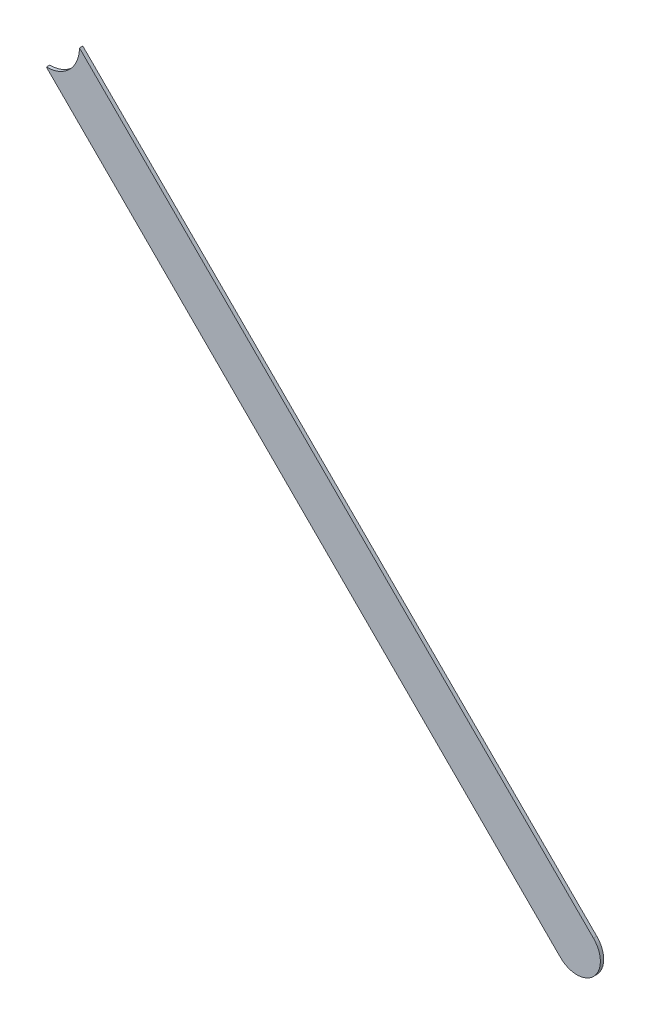
ISO-10303-21;
HEADER;
FILE_DESCRIPTION(('STEP AP214'),'2;1');
FILE_NAME('part.step','',(''),(''),'','','');
FILE_SCHEMA(('AUTOMOTIVE_DESIGN { 1 0 10303 214 1 1 1 1 }'));
ENDSEC;
DATA;
#1=APPLICATION_CONTEXT('core data for automotive mechanical design processes');
#2=APPLICATION_PROTOCOL_DEFINITION('international standard','automotive_design',2000,#1);
#3=PRODUCT_CONTEXT('',#1,'mechanical');
#4=PRODUCT('Part','Part','',(#3));
#5=PRODUCT_RELATED_PRODUCT_CATEGORY('part','',(#4));
#6=PRODUCT_DEFINITION_FORMATION('','',#4);
#7=PRODUCT_DEFINITION_CONTEXT('part definition',#1,'design');
#8=PRODUCT_DEFINITION('design','',#6,#7);
#9=PRODUCT_DEFINITION_SHAPE('','',#8);
#10=(LENGTH_UNIT() NAMED_UNIT(*) SI_UNIT(.MILLI.,.METRE.));
#11=(NAMED_UNIT(*) PLANE_ANGLE_UNIT() SI_UNIT($,.RADIAN.));
#12=(NAMED_UNIT(*) SI_UNIT($,.STERADIAN.) SOLID_ANGLE_UNIT());
#13=UNCERTAINTY_MEASURE_WITH_UNIT(LENGTH_MEASURE(1.E-05),#10,'distance_accuracy_value','');
#14=(GEOMETRIC_REPRESENTATION_CONTEXT(3) GLOBAL_UNCERTAINTY_ASSIGNED_CONTEXT((#13)) GLOBAL_UNIT_ASSIGNED_CONTEXT((#10,
#11,#12)) REPRESENTATION_CONTEXT('',''));
#15=CARTESIAN_POINT('',(0.,0.,0.));
#16=DIRECTION('',(0.,0.,1.));
#17=DIRECTION('',(1.,0.,0.));
#18=AXIS2_PLACEMENT_3D('',#15,#16,#17);
#19=CARTESIAN_POINT('',(56.9020529873501,105.144423450347,0.));
#20=DIRECTION('',(0.707109949176586,0.707103613182315,0.));
#21=DIRECTION('',(0.707103613182315,-0.707109949176586,0.));
#22=AXIS2_PLACEMENT_3D('',#19,#20,#21);
#23=PLANE('',#22);
#24=DIRECTION('',(0.707103613182315,-0.707109949176586,0.));
#25=VECTOR('',#24,1.);
#26=CARTESIAN_POINT('',(56.72323428,105.32324376,0.03556));
#27=LINE('',#26,#25);
#28=CARTESIAN_POINT('',(56.9020529873501,105.144423450347,0.03556));
#29=VERTEX_POINT('',#28);
#30=CARTESIAN_POINT('',(62.39256762,99.65385962,0.03556));
#31=VERTEX_POINT('',#30);
#32=EDGE_CURVE('E11',#29,#31,#27,.T.);
#33=ORIENTED_EDGE('',*,*,#32,.F.);
#34=DIRECTION('',(0.,0.,1.));
#35=VECTOR('',#34,1.);
#36=CARTESIAN_POINT('',(56.9020529873501,105.144423450347,0.));
#37=LINE('',#36,#35);
#38=CARTESIAN_POINT('',(56.9020529873501,105.144423450347,0.));
#39=VERTEX_POINT('',#38);
#40=EDGE_CURVE('E24',#39,#29,#37,.T.);
#41=ORIENTED_EDGE('',*,*,#40,.F.);
#42=DIRECTION('',(0.707103613182315,-0.707109949176586,0.));
#43=VECTOR('',#42,1.);
#44=CARTESIAN_POINT('',(56.72323428,105.32324376,0.));
#45=LINE('',#44,#43);
#46=CARTESIAN_POINT('',(62.39256762,99.65385962,0.));
#47=VERTEX_POINT('',#46);
#48=EDGE_CURVE('E75',#39,#47,#45,.T.);
#49=ORIENTED_EDGE('',*,*,#48,.T.);
#50=DIRECTION('',(0.,0.,1.));
#51=VECTOR('',#50,1.);
#52=CARTESIAN_POINT('',(62.39256762,99.65385962,0.));
#53=LINE('',#52,#51);
#54=EDGE_CURVE('E37',#47,#31,#53,.T.);
#55=ORIENTED_EDGE('',*,*,#54,.T.);
#56=EDGE_LOOP('',(#33,#41,#49,#55));
#57=FACE_BOUND('',#56,.T.);
#58=ADVANCED_FACE('F17',(#57),#23,.F.);
#59=CARTESIAN_POINT('',(62.56934527,99.83063473,0.));
#60=DIRECTION('',(0.,0.,-1.));
#61=DIRECTION('',(-0.70711186117734,-0.707101701159259,0.));
#62=AXIS2_PLACEMENT_3D('',#59,#60,#61);
#63=CYLINDRICAL_SURFACE('',#62,0.249999554109676);
#64=CARTESIAN_POINT('',(62.56934527,99.83063473,0.03556));
#65=DIRECTION('',(0.,0.,1.));
#66=DIRECTION('',(-0.70711186117734,-0.707101701159259,0.));
#67=AXIS2_PLACEMENT_3D('',#64,#65,#66);
#68=CIRCLE('',#67,0.249999554109676);
#69=CARTESIAN_POINT('',(62.74612292,100.00740984,0.03556));
#70=VERTEX_POINT('',#69);
#71=EDGE_CURVE('E83',#31,#70,#68,.T.);
#72=ORIENTED_EDGE('',*,*,#71,.F.);
#73=ORIENTED_EDGE('',*,*,#54,.F.);
#74=CARTESIAN_POINT('',(62.56934527,99.83063473,0.));
#75=DIRECTION('',(0.,0.,1.));
#76=DIRECTION('',(-0.70711186117734,-0.707101701159259,0.));
#77=AXIS2_PLACEMENT_3D('',#74,#75,#76);
#78=CIRCLE('',#77,0.249999554109676);
#79=CARTESIAN_POINT('',(62.74612292,100.00740984,0.));
#80=VERTEX_POINT('',#79);
#81=EDGE_CURVE('E81',#47,#80,#78,.T.);
#82=ORIENTED_EDGE('',*,*,#81,.T.);
#83=DIRECTION('',(0.,0.,1.));
#84=VECTOR('',#83,1.);
#85=CARTESIAN_POINT('',(62.74612292,100.00740984,0.));
#86=LINE('',#85,#84);
#87=EDGE_CURVE('E67',#80,#70,#86,.T.);
#88=ORIENTED_EDGE('',*,*,#87,.T.);
#89=EDGE_LOOP('',(#72,#73,#82,#88));
#90=FACE_BOUND('',#89,.T.);
#91=ADVANCED_FACE('F89',(#90),#63,.T.);
#92=CARTESIAN_POINT('',(62.74612292,100.00740984,0.));
#93=DIRECTION('',(-0.707109949176585,-0.707103613182317,0.));
#94=DIRECTION('',(-0.707103613182317,0.707109949176585,0.));
#95=AXIS2_PLACEMENT_3D('',#92,#93,#94);
#96=PLANE('',#95);
#97=DIRECTION('',(-0.707103613182317,0.707109949176585,0.));
#98=VECTOR('',#97,1.);
#99=CARTESIAN_POINT('',(62.74612292,100.00740984,0.03556));
#100=LINE('',#99,#98);
#101=CARTESIAN_POINT('',(57.2556073313614,105.497974626344,0.03556));
#102=VERTEX_POINT('',#101);
#103=EDGE_CURVE('E71',#70,#102,#100,.T.);
#104=ORIENTED_EDGE('',*,*,#103,.F.);
#105=ORIENTED_EDGE('',*,*,#87,.F.);
#106=DIRECTION('',(-0.707103613182317,0.707109949176585,0.));
#107=VECTOR('',#106,1.);
#108=CARTESIAN_POINT('',(62.74612292,100.00740984,0.));
#109=LINE('',#108,#107);
#110=CARTESIAN_POINT('',(57.2556073313614,105.497974626344,0.));
#111=VERTEX_POINT('',#110);
#112=EDGE_CURVE('E63',#80,#111,#109,.T.);
#113=ORIENTED_EDGE('',*,*,#112,.T.);
#114=DIRECTION('',(0.,0.,1.));
#115=VECTOR('',#114,1.);
#116=CARTESIAN_POINT('',(57.2556073313614,105.497974626344,0.));
#117=LINE('',#116,#115);
#118=EDGE_CURVE('E53',#111,#102,#117,.T.);
#119=ORIENTED_EDGE('',*,*,#118,.T.);
#120=EDGE_LOOP('',(#104,#105,#113,#119));
#121=FACE_BOUND('',#120,.T.);
#122=ADVANCED_FACE('F66',(#121),#96,.F.);
#123=CARTESIAN_POINT('',(56.9000132,105.5000176,0.));
#124=DIRECTION('',(0.,0.,-1.));
#125=DIRECTION('',(1.,0.,0.));
#126=AXIS2_PLACEMENT_3D('',#123,#124,#125);
#127=CYLINDRICAL_SURFACE('',#126,0.3556);
#128=ORIENTED_EDGE('',*,*,#40,.T.);
#129=CARTESIAN_POINT('',(56.9000132,105.5000176,0.03556));
#130=DIRECTION('',(0.,0.,1.));
#131=DIRECTION('',(1.,0.,0.));
#132=AXIS2_PLACEMENT_3D('',#129,#130,#131);
#133=CIRCLE('',#132,0.3556);
#134=EDGE_CURVE('E59',#29,#102,#133,.T.);
#135=ORIENTED_EDGE('',*,*,#134,.T.);
#136=ORIENTED_EDGE('',*,*,#118,.F.);
#137=CARTESIAN_POINT('',(56.9000132,105.5000176,0.));
#138=DIRECTION('',(0.,0.,1.));
#139=DIRECTION('',(1.,0.,0.));
#140=AXIS2_PLACEMENT_3D('',#137,#138,#139);
#141=CIRCLE('',#140,0.3556);
#142=EDGE_CURVE('E57',#39,#111,#141,.T.);
#143=ORIENTED_EDGE('',*,*,#142,.F.);
#144=EDGE_LOOP('',(#128,#135,#136,#143));
#145=FACE_BOUND('',#144,.T.);
#146=ADVANCED_FACE('F55',(#145),#127,.F.);
#147=CARTESIAN_POINT('',(56.72323428,105.32324376,0.));
#148=DIRECTION('',(0.,0.,-1.));
#149=DIRECTION('',(-1.,0.,0.));
#150=AXIS2_PLACEMENT_3D('',#147,#148,#149);
#151=PLANE('',#150);
#152=ORIENTED_EDGE('',*,*,#48,.F.);
#153=ORIENTED_EDGE('',*,*,#142,.T.);
#154=ORIENTED_EDGE('',*,*,#112,.F.);
#155=ORIENTED_EDGE('',*,*,#81,.F.);
#156=EDGE_LOOP('',(#152,#153,#154,#155));
#157=FACE_BOUND('',#156,.T.);
#158=ADVANCED_FACE('F74',(#157),#151,.T.);
#159=CARTESIAN_POINT('',(56.72323428,105.32324376,0.03556));
#160=DIRECTION('',(0.,0.,-1.));
#161=DIRECTION('',(-1.,0.,0.));
#162=AXIS2_PLACEMENT_3D('',#159,#160,#161);
#163=PLANE('',#162);
#164=ORIENTED_EDGE('',*,*,#134,.F.);
#165=ORIENTED_EDGE('',*,*,#32,.T.);
#166=ORIENTED_EDGE('',*,*,#71,.T.);
#167=ORIENTED_EDGE('',*,*,#103,.T.);
#168=EDGE_LOOP('',(#164,#165,#166,#167));
#169=FACE_BOUND('',#168,.T.);
#170=ADVANCED_FACE('F91',(#169),#163,.F.);
#171=CLOSED_SHELL('',(#58,#91,#122,#146,#158,#170));
#172=MANIFOLD_SOLID_BREP('B1',#171);
#173=ADVANCED_BREP_SHAPE_REPRESENTATION('',(#18,#172),#14);
#174=SHAPE_DEFINITION_REPRESENTATION(#9,#173);
ENDSEC;
END-ISO-10303-21;
